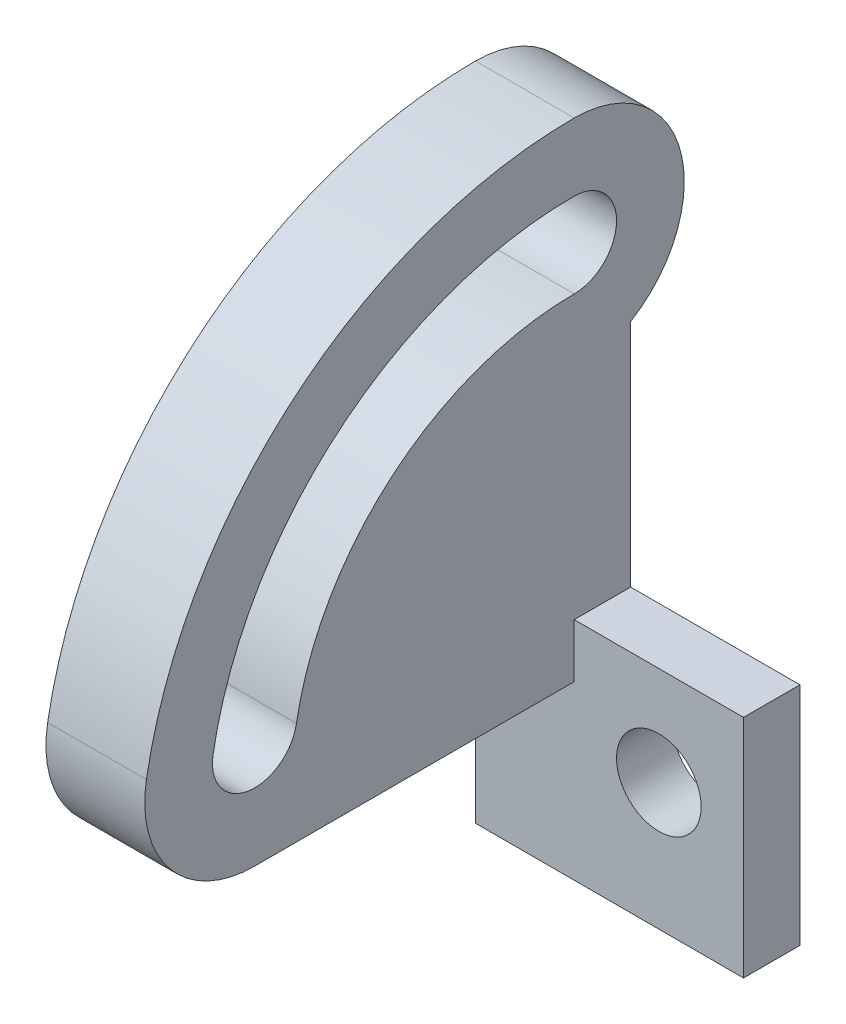
ISO-10303-21;
HEADER;
FILE_DESCRIPTION(('STEP AP214'),'2;1');
FILE_NAME('part.step','',(''),(''),'','','');
FILE_SCHEMA(('AUTOMOTIVE_DESIGN { 1 0 10303 214 1 1 1 1 }'));
ENDSEC;
DATA;
#1=APPLICATION_CONTEXT('core data for automotive mechanical design processes');
#2=APPLICATION_PROTOCOL_DEFINITION('international standard','automotive_design',2000,#1);
#3=PRODUCT_CONTEXT('',#1,'mechanical');
#4=PRODUCT('Part','Part','',(#3));
#5=PRODUCT_RELATED_PRODUCT_CATEGORY('part','',(#4));
#6=PRODUCT_DEFINITION_FORMATION('','',#4);
#7=PRODUCT_DEFINITION_CONTEXT('part definition',#1,'design');
#8=PRODUCT_DEFINITION('design','',#6,#7);
#9=PRODUCT_DEFINITION_SHAPE('','',#8);
#10=(LENGTH_UNIT() NAMED_UNIT(*) SI_UNIT(.MILLI.,.METRE.));
#11=(NAMED_UNIT(*) PLANE_ANGLE_UNIT() SI_UNIT($,.RADIAN.));
#12=(NAMED_UNIT(*) SI_UNIT($,.STERADIAN.) SOLID_ANGLE_UNIT());
#13=UNCERTAINTY_MEASURE_WITH_UNIT(LENGTH_MEASURE(1.E-05),#10,'distance_accuracy_value','');
#14=(GEOMETRIC_REPRESENTATION_CONTEXT(3) GLOBAL_UNCERTAINTY_ASSIGNED_CONTEXT((#13)) GLOBAL_UNIT_ASSIGNED_CONTEXT((#10,
#11,#12)) REPRESENTATION_CONTEXT('',''));
#15=CARTESIAN_POINT('',(0.,0.,0.));
#16=DIRECTION('',(0.,0.,1.));
#17=DIRECTION('',(1.,0.,0.));
#18=AXIS2_PLACEMENT_3D('',#15,#16,#17);
#19=CARTESIAN_POINT('',(-40.8872702973605,15.5365853658537,2.));
#20=DIRECTION('',(0.,-1.,0.));
#21=DIRECTION('',(0.,0.,-1.));
#22=AXIS2_PLACEMENT_3D('',#19,#20,#21);
#23=PLANE('',#22);
#24=DIRECTION('',(-1.,0.,0.));
#25=VECTOR('',#24,1.);
#26=CARTESIAN_POINT('',(-40.8872702973605,15.5365853658537,2.));
#27=LINE('',#26,#25);
#28=CARTESIAN_POINT('',(-34.3872702973605,15.5365853658537,2.));
#29=VERTEX_POINT('',#28);
#30=CARTESIAN_POINT('',(-40.3872702973605,15.5365853658537,2.));
#31=VERTEX_POINT('',#30);
#32=EDGE_CURVE('E11',#29,#31,#27,.T.);
#33=ORIENTED_EDGE('',*,*,#32,.F.);
#34=DIRECTION('',(0.,0.,1.));
#35=VECTOR('',#34,1.);
#36=CARTESIAN_POINT('',(-34.3872702973605,15.5365853658537,0.));
#37=LINE('',#36,#35);
#38=CARTESIAN_POINT('',(-34.3872702973605,15.5365853658537,0.));
#39=VERTEX_POINT('',#38);
#40=EDGE_CURVE('E130',#39,#29,#37,.T.);
#41=ORIENTED_EDGE('',*,*,#40,.F.);
#42=DIRECTION('',(-1.,0.,0.));
#43=VECTOR('',#42,1.);
#44=CARTESIAN_POINT('',(-40.8872702973605,15.5365853658537,0.));
#45=LINE('',#44,#43);
#46=CARTESIAN_POINT('',(-40.3872702973605,15.5365853658537,0.));
#47=VERTEX_POINT('',#46);
#48=EDGE_CURVE('E36',#39,#47,#45,.T.);
#49=ORIENTED_EDGE('',*,*,#48,.T.);
#50=DIRECTION('',(0.,0.,1.));
#51=VECTOR('',#50,1.);
#52=CARTESIAN_POINT('',(-40.3872702973605,15.5365853658537,2.));
#53=LINE('',#52,#51);
#54=EDGE_CURVE('E192',#47,#31,#53,.T.);
#55=ORIENTED_EDGE('',*,*,#54,.T.);
#56=EDGE_LOOP('',(#33,#41,#49,#55));
#57=FACE_BOUND('',#56,.T.);
#58=ADVANCED_FACE('F33',(#57),#23,.F.);
#59=CARTESIAN_POINT('',(0.,0.,2.));
#60=DIRECTION('',(0.,0.,1.));
#61=DIRECTION('',(1.,0.,0.));
#62=AXIS2_PLACEMENT_3D('',#59,#60,#61);
#63=PLANE('',#62);
#64=DIRECTION('',(1.,0.,0.));
#65=VECTOR('',#64,1.);
#66=CARTESIAN_POINT('',(-40.8872702973605,7.53658536585366,2.));
#67=LINE('',#66,#65);
#68=CARTESIAN_POINT('',(-43.8872702973605,7.53658536585366,2.));
#69=VERTEX_POINT('',#68);
#70=CARTESIAN_POINT('',(-34.3872702973605,7.53658536585367,2.));
#71=VERTEX_POINT('',#70);
#72=EDGE_CURVE('E159',#69,#71,#67,.T.);
#73=ORIENTED_EDGE('',*,*,#72,.T.);
#74=DIRECTION('',(0.,-1.,0.));
#75=VECTOR('',#74,1.);
#76=CARTESIAN_POINT('',(-34.3872702973605,15.5365853658537,2.));
#77=LINE('',#76,#75);
#78=EDGE_CURVE('E136',#29,#71,#77,.T.);
#79=ORIENTED_EDGE('',*,*,#78,.F.);
#80=ORIENTED_EDGE('',*,*,#32,.T.);
#81=DIRECTION('',(0.,-1.,0.));
#82=VECTOR('',#81,1.);
#83=CARTESIAN_POINT('',(-40.3872702973605,13.6332115861991,2.));
#84=LINE('',#83,#82);
#85=CARTESIAN_POINT('',(-40.3872702973605,13.6332115861991,2.));
#86=VERTEX_POINT('',#85);
#87=EDGE_CURVE('E46',#31,#86,#84,.T.);
#88=ORIENTED_EDGE('',*,*,#87,.T.);
#89=DIRECTION('',(-1.,0.,0.));
#90=VECTOR('',#89,1.);
#91=CARTESIAN_POINT('',(-40.3872702973605,13.6332115861991,2.));
#92=LINE('',#91,#90);
#93=CARTESIAN_POINT('',(-43.8872702973605,13.6332115861991,2.));
#94=VERTEX_POINT('',#93);
#95=EDGE_CURVE('E168',#86,#94,#92,.T.);
#96=ORIENTED_EDGE('',*,*,#95,.T.);
#97=DIRECTION('',(0.,-1.,0.));
#98=VECTOR('',#97,1.);
#99=CARTESIAN_POINT('',(-43.8872702973605,15.5365853658537,2.));
#100=LINE('',#99,#98);
#101=EDGE_CURVE('E162',#94,#69,#100,.T.);
#102=ORIENTED_EDGE('',*,*,#101,.T.);
#103=EDGE_LOOP('',(#73,#79,#80,#88,#96,#102));
#104=FACE_BOUND('',#103,.T.);
#105=CARTESIAN_POINT('',(-37.3872702973605,12.0365853658537,2.));
#106=DIRECTION('',(0.,0.,1.));
#107=DIRECTION('',(1.,0.,0.));
#108=AXIS2_PLACEMENT_3D('',#105,#106,#107);
#109=CIRCLE('',#108,1.5);
#110=CARTESIAN_POINT('',(-35.8872702973605,12.0365853658537,2.));
#111=VERTEX_POINT('',#110);
#112=EDGE_CURVE('E146',#111,#111,#109,.T.);
#113=ORIENTED_EDGE('',*,*,#112,.F.);
#114=EDGE_LOOP('',(#113));
#115=FACE_BOUND('',#114,.T.);
#116=ADVANCED_FACE('F239',(#104,#115),#63,.T.);
#117=CARTESIAN_POINT('',(0.,0.,0.));
#118=DIRECTION('',(0.,0.,1.));
#119=DIRECTION('',(1.,0.,0.));
#120=AXIS2_PLACEMENT_3D('',#117,#118,#119);
#121=PLANE('',#120);
#122=DIRECTION('',(0.,-1.,0.));
#123=VECTOR('',#122,1.);
#124=CARTESIAN_POINT('',(-34.3872702973605,15.5365853658537,0.));
#125=LINE('',#124,#123);
#126=CARTESIAN_POINT('',(-34.3872702973605,7.53658536585367,0.));
#127=VERTEX_POINT('',#126);
#128=EDGE_CURVE('E126',#39,#127,#125,.T.);
#129=ORIENTED_EDGE('',*,*,#128,.T.);
#130=DIRECTION('',(1.,0.,0.));
#131=VECTOR('',#130,1.);
#132=CARTESIAN_POINT('',(-40.8872702973605,7.53658536585366,0.));
#133=LINE('',#132,#131);
#134=CARTESIAN_POINT('',(-43.8872702973605,7.53658536585366,0.));
#135=VERTEX_POINT('',#134);
#136=EDGE_CURVE('E158',#135,#127,#133,.T.);
#137=ORIENTED_EDGE('',*,*,#136,.F.);
#138=DIRECTION('',(0.,-1.,0.));
#139=VECTOR('',#138,1.);
#140=CARTESIAN_POINT('',(-43.8872702973605,15.5365853658537,0.));
#141=LINE('',#140,#139);
#142=CARTESIAN_POINT('',(-43.8872702973605,23.6865637008933,0.));
#143=VERTEX_POINT('',#142);
#144=EDGE_CURVE('E161',#143,#135,#141,.T.);
#145=ORIENTED_EDGE('',*,*,#144,.F.);
#146=DIRECTION('',(-1.,0.,0.));
#147=VECTOR('',#146,1.);
#148=CARTESIAN_POINT('',(-40.3872702973605,23.6865637008933,0.));
#149=LINE('',#148,#147);
#150=CARTESIAN_POINT('',(-40.3872702973605,23.6865637008933,0.));
#151=VERTEX_POINT('',#150);
#152=EDGE_CURVE('E164',#151,#143,#149,.T.);
#153=ORIENTED_EDGE('',*,*,#152,.F.);
#154=DIRECTION('',(0.,-1.,0.));
#155=VECTOR('',#154,1.);
#156=CARTESIAN_POINT('',(-40.3872702973605,15.5365853658537,0.));
#157=LINE('',#156,#155);
#158=EDGE_CURVE('E145',#151,#47,#157,.T.);
#159=ORIENTED_EDGE('',*,*,#158,.T.);
#160=ORIENTED_EDGE('',*,*,#48,.F.);
#161=EDGE_LOOP('',(#129,#137,#145,#153,#159,#160));
#162=FACE_BOUND('',#161,.T.);
#163=CARTESIAN_POINT('',(-37.3872702973605,12.0365853658537,0.));
#164=DIRECTION('',(0.,0.,1.));
#165=DIRECTION('',(1.,0.,0.));
#166=AXIS2_PLACEMENT_3D('',#163,#164,#165);
#167=CIRCLE('',#166,1.5);
#168=CARTESIAN_POINT('',(-35.8872702973605,12.0365853658537,0.));
#169=VERTEX_POINT('',#168);
#170=EDGE_CURVE('E148',#169,#169,#167,.T.);
#171=ORIENTED_EDGE('',*,*,#170,.T.);
#172=EDGE_LOOP('',(#171));
#173=FACE_BOUND('',#172,.T.);
#174=ADVANCED_FACE('F142',(#162,#173),#121,.F.);
#175=CARTESIAN_POINT('',(-37.3872702973605,12.0365853658537,2.));
#176=DIRECTION('',(0.,0.,-1.));
#177=DIRECTION('',(-1.,0.,0.));
#178=AXIS2_PLACEMENT_3D('',#175,#176,#177);
#179=CYLINDRICAL_SURFACE('',#178,1.5);
#180=ORIENTED_EDGE('',*,*,#112,.T.);
#181=EDGE_LOOP('',(#180));
#182=FACE_BOUND('',#181,.T.);
#183=ORIENTED_EDGE('',*,*,#170,.F.);
#184=EDGE_LOOP('',(#183));
#185=FACE_BOUND('',#184,.T.);
#186=ADVANCED_FACE('F282',(#182,#185),#179,.F.);
#187=CARTESIAN_POINT('',(-40.8872702973605,7.53658536585366,0.));
#188=DIRECTION('',(0.,-1.,0.));
#189=DIRECTION('',(0.,0.,-1.));
#190=AXIS2_PLACEMENT_3D('',#187,#188,#189);
#191=PLANE('',#190);
#192=ORIENTED_EDGE('',*,*,#72,.F.);
#193=DIRECTION('',(0.,0.,1.));
#194=VECTOR('',#193,1.);
#195=CARTESIAN_POINT('',(-43.8872702973605,7.53658536585366,0.));
#196=LINE('',#195,#194);
#197=EDGE_CURVE('E153',#135,#69,#196,.T.);
#198=ORIENTED_EDGE('',*,*,#197,.F.);
#199=ORIENTED_EDGE('',*,*,#136,.T.);
#200=DIRECTION('',(0.,0.,1.));
#201=VECTOR('',#200,1.);
#202=CARTESIAN_POINT('',(-34.3872702973605,7.53658536585367,0.));
#203=LINE('',#202,#201);
#204=EDGE_CURVE('E132',#127,#71,#203,.T.);
#205=ORIENTED_EDGE('',*,*,#204,.T.);
#206=EDGE_LOOP('',(#192,#198,#199,#205));
#207=FACE_BOUND('',#206,.T.);
#208=ADVANCED_FACE('F243',(#207),#191,.T.);
#209=CARTESIAN_POINT('',(-43.8872702973605,15.5365853658537,0.));
#210=DIRECTION('',(-1.,0.,0.));
#211=DIRECTION('',(0.,0.,1.));
#212=AXIS2_PLACEMENT_3D('',#209,#210,#211);
#213=PLANE('',#212);
#214=ORIENTED_EDGE('',*,*,#101,.F.);
#215=DIRECTION('',(0.,0.,1.));
#216=VECTOR('',#215,1.);
#217=CARTESIAN_POINT('',(-43.8872702973605,13.6332115861991,13.3234299840174));
#218=LINE('',#217,#216);
#219=CARTESIAN_POINT('',(-43.8872702973605,13.6332115861991,13.3234299840174));
#220=VERTEX_POINT('',#219);
#221=EDGE_CURVE('E223',#94,#220,#218,.T.);
#222=ORIENTED_EDGE('',*,*,#221,.T.);
#223=CARTESIAN_POINT('',(-43.8872702973605,17.5332115861991,13.3234299840174));
#224=DIRECTION('',(-1.,0.,0.));
#225=DIRECTION('',(0.,-1.,0.));
#226=AXIS2_PLACEMENT_3D('',#223,#224,#225);
#227=CIRCLE('',#226,3.89999999999999);
#228=CARTESIAN_POINT('',(-43.8872702973605,18.2104394791001,17.164180220765));
#229=VERTEX_POINT('',#228);
#230=EDGE_CURVE('E220',#220,#229,#227,.T.);
#231=ORIENTED_EDGE('',*,*,#230,.T.);
#232=CARTESIAN_POINT('',(-43.8872702973605,15.5365853658537,2.));
#233=DIRECTION('',(-1.,0.,0.));
#234=DIRECTION('',(0.,-1.,0.));
#235=AXIS2_PLACEMENT_3D('',#232,#233,#234);
#236=CIRCLE('',#235,15.3981121435962);
#237=CARTESIAN_POINT('',(-43.8872702973605,30.9346975094499,2.));
#238=VERTEX_POINT('',#237);
#239=EDGE_CURVE('E217',#229,#238,#236,.T.);
#240=ORIENTED_EDGE('',*,*,#239,.T.);
#241=CARTESIAN_POINT('',(-43.8872702973605,27.0346975094499,2.));
#242=DIRECTION('',(-1.,0.,0.));
#243=DIRECTION('',(0.,-1.,0.));
#244=AXIS2_PLACEMENT_3D('',#241,#242,#243);
#245=CIRCLE('',#244,3.9);
#246=EDGE_CURVE('E214',#238,#143,#245,.T.);
#247=ORIENTED_EDGE('',*,*,#246,.T.);
#248=ORIENTED_EDGE('',*,*,#144,.T.);
#249=ORIENTED_EDGE('',*,*,#197,.T.);
#250=EDGE_LOOP('',(#214,#222,#231,#240,#247,#248,#249));
#251=FACE_BOUND('',#250,.T.);
#252=CARTESIAN_POINT('',(-43.8872702973605,15.5365853658537,2.));
#253=DIRECTION('',(1.,0.,0.));
#254=DIRECTION('',(0.,-1.,0.));
#255=AXIS2_PLACEMENT_3D('',#252,#253,#254);
#256=CIRCLE('',#255,9.99811214359624);
#257=CARTESIAN_POINT('',(-43.8872702973605,25.5346975094499,2.));
#258=VERTEX_POINT('',#257);
#259=CARTESIAN_POINT('',(-43.8872702973605,17.2727393196987,11.8462183544991));
#260=VERTEX_POINT('',#259);
#261=EDGE_CURVE('E232',#258,#260,#256,.T.);
#262=ORIENTED_EDGE('',*,*,#261,.F.);
#263=CARTESIAN_POINT('',(-43.8872702973605,27.0346975094499,2.));
#264=DIRECTION('',(-1.,0.,0.));
#265=DIRECTION('',(0.,-1.,0.));
#266=AXIS2_PLACEMENT_3D('',#263,#264,#265);
#267=CIRCLE('',#266,1.5);
#268=CARTESIAN_POINT('',(-43.8872702973605,28.5346975094499,2.));
#269=VERTEX_POINT('',#268);
#270=EDGE_CURVE('E235',#269,#258,#267,.T.);
#271=ORIENTED_EDGE('',*,*,#270,.F.);
#272=CARTESIAN_POINT('',(-43.8872702973605,15.5365853658537,2.));
#273=DIRECTION('',(-1.,0.,0.));
#274=DIRECTION('',(0.,-1.,0.));
#275=AXIS2_PLACEMENT_3D('',#272,#273,#274);
#276=CIRCLE('',#275,12.9981121435962);
#277=CARTESIAN_POINT('',(-43.8872702973605,17.7936838526995,14.8006416135357));
#278=VERTEX_POINT('',#277);
#279=EDGE_CURVE('E226',#278,#269,#276,.T.);
#280=ORIENTED_EDGE('',*,*,#279,.F.);
#281=CARTESIAN_POINT('',(-43.8872702973605,17.5332115861991,13.3234299840174));
#282=DIRECTION('',(-1.,0.,0.));
#283=DIRECTION('',(0.,-1.,0.));
#284=AXIS2_PLACEMENT_3D('',#281,#282,#283);
#285=CIRCLE('',#284,1.5);
#286=EDGE_CURVE('E229',#260,#278,#285,.T.);
#287=ORIENTED_EDGE('',*,*,#286,.F.);
#288=EDGE_LOOP('',(#262,#271,#280,#287));
#289=FACE_BOUND('',#288,.T.);
#290=ADVANCED_FACE('F249',(#251,#289),#213,.T.);
#291=CARTESIAN_POINT('',(-40.3872702973605,27.0346975094499,2.));
#292=DIRECTION('',(-1.,0.,0.));
#293=DIRECTION('',(0.,-1.,0.));
#294=AXIS2_PLACEMENT_3D('',#291,#292,#293);
#295=CYLINDRICAL_SURFACE('',#294,3.9);
#296=ORIENTED_EDGE('',*,*,#152,.T.);
#297=ORIENTED_EDGE('',*,*,#246,.F.);
#298=DIRECTION('',(-1.,0.,0.));
#299=VECTOR('',#298,1.);
#300=CARTESIAN_POINT('',(-40.3872702973605,30.9346975094499,2.));
#301=LINE('',#300,#299);
#302=CARTESIAN_POINT('',(-40.3872702973605,30.9346975094499,2.));
#303=VERTEX_POINT('',#302);
#304=EDGE_CURVE('E174',#303,#238,#301,.T.);
#305=ORIENTED_EDGE('',*,*,#304,.F.);
#306=CARTESIAN_POINT('',(-40.3872702973605,27.0346975094499,2.));
#307=DIRECTION('',(-1.,0.,0.));
#308=DIRECTION('',(0.,-1.,0.));
#309=AXIS2_PLACEMENT_3D('',#306,#307,#308);
#310=CIRCLE('',#309,3.9);
#311=EDGE_CURVE('E179',#303,#151,#310,.T.);
#312=ORIENTED_EDGE('',*,*,#311,.T.);
#313=EDGE_LOOP('',(#296,#297,#305,#312));
#314=FACE_BOUND('',#313,.T.);
#315=ADVANCED_FACE('F247',(#314),#295,.T.);
#316=CARTESIAN_POINT('',(-40.3872702973605,15.5365853658537,2.));
#317=DIRECTION('',(-1.,0.,0.));
#318=DIRECTION('',(0.,-1.,0.));
#319=AXIS2_PLACEMENT_3D('',#316,#317,#318);
#320=CYLINDRICAL_SURFACE('',#319,15.3981121435962);
#321=ORIENTED_EDGE('',*,*,#304,.T.);
#322=ORIENTED_EDGE('',*,*,#239,.F.);
#323=DIRECTION('',(-1.,0.,0.));
#324=VECTOR('',#323,1.);
#325=CARTESIAN_POINT('',(-40.3872702973605,18.2104394791001,17.164180220765));
#326=LINE('',#325,#324);
#327=CARTESIAN_POINT('',(-40.3872702973605,18.2104394791001,17.164180220765));
#328=VERTEX_POINT('',#327);
#329=EDGE_CURVE('E172',#328,#229,#326,.T.);
#330=ORIENTED_EDGE('',*,*,#329,.F.);
#331=CARTESIAN_POINT('',(-40.3872702973605,15.5365853658537,2.));
#332=DIRECTION('',(-1.,0.,0.));
#333=DIRECTION('',(0.,-1.,0.));
#334=AXIS2_PLACEMENT_3D('',#331,#332,#333);
#335=CIRCLE('',#334,15.3981121435962);
#336=EDGE_CURVE('E182',#328,#303,#335,.T.);
#337=ORIENTED_EDGE('',*,*,#336,.T.);
#338=EDGE_LOOP('',(#321,#322,#330,#337));
#339=FACE_BOUND('',#338,.T.);
#340=ADVANCED_FACE('F254',(#339),#320,.T.);
#341=CARTESIAN_POINT('',(-40.3872702973605,17.5332115861991,13.3234299840174));
#342=DIRECTION('',(-1.,0.,0.));
#343=DIRECTION('',(0.,-1.,0.));
#344=AXIS2_PLACEMENT_3D('',#341,#342,#343);
#345=CYLINDRICAL_SURFACE('',#344,3.89999999999999);
#346=ORIENTED_EDGE('',*,*,#329,.T.);
#347=ORIENTED_EDGE('',*,*,#230,.F.);
#348=DIRECTION('',(-1.,0.,0.));
#349=VECTOR('',#348,1.);
#350=CARTESIAN_POINT('',(-40.3872702973605,13.6332115861991,13.3234299840174));
#351=LINE('',#350,#349);
#352=CARTESIAN_POINT('',(-40.3872702973605,13.6332115861991,13.3234299840174));
#353=VERTEX_POINT('',#352);
#354=EDGE_CURVE('E170',#353,#220,#351,.T.);
#355=ORIENTED_EDGE('',*,*,#354,.F.);
#356=CARTESIAN_POINT('',(-40.3872702973605,17.5332115861991,13.3234299840174));
#357=DIRECTION('',(-1.,0.,0.));
#358=DIRECTION('',(0.,-1.,0.));
#359=AXIS2_PLACEMENT_3D('',#356,#357,#358);
#360=CIRCLE('',#359,3.89999999999999);
#361=EDGE_CURVE('E185',#353,#328,#360,.T.);
#362=ORIENTED_EDGE('',*,*,#361,.T.);
#363=EDGE_LOOP('',(#346,#347,#355,#362));
#364=FACE_BOUND('',#363,.T.);
#365=ADVANCED_FACE('F264',(#364),#345,.T.);
#366=CARTESIAN_POINT('',(-40.3872702973605,13.6332115861991,13.3234299840174));
#367=DIRECTION('',(0.,-1.,0.));
#368=DIRECTION('',(1.,0.,0.));
#369=AXIS2_PLACEMENT_3D('',#366,#367,#368);
#370=PLANE('',#369);
#371=ORIENTED_EDGE('',*,*,#354,.T.);
#372=ORIENTED_EDGE('',*,*,#221,.F.);
#373=ORIENTED_EDGE('',*,*,#95,.F.);
#374=DIRECTION('',(0.,0.,1.));
#375=VECTOR('',#374,1.);
#376=CARTESIAN_POINT('',(-40.3872702973605,13.6332115861991,13.3234299840174));
#377=LINE('',#376,#375);
#378=EDGE_CURVE('E188',#86,#353,#377,.T.);
#379=ORIENTED_EDGE('',*,*,#378,.T.);
#380=EDGE_LOOP('',(#371,#372,#373,#379));
#381=FACE_BOUND('',#380,.T.);
#382=ADVANCED_FACE('F261',(#381),#370,.T.);
#383=CARTESIAN_POINT('',(-40.3872702973605,27.0346975094499,2.));
#384=DIRECTION('',(-1.,0.,0.));
#385=DIRECTION('',(0.,-1.,0.));
#386=AXIS2_PLACEMENT_3D('',#383,#384,#385);
#387=PLANE('',#386);
#388=CARTESIAN_POINT('',(-40.3872702973605,15.5365853658537,2.));
#389=DIRECTION('',(-1.,0.,0.));
#390=DIRECTION('',(0.,-1.,0.));
#391=AXIS2_PLACEMENT_3D('',#388,#389,#390);
#392=CIRCLE('',#391,12.9981121435962);
#393=CARTESIAN_POINT('',(-40.3872702973605,17.7936838526995,14.8006416135357));
#394=VERTEX_POINT('',#393);
#395=CARTESIAN_POINT('',(-40.3872702973605,28.5346975094499,2.));
#396=VERTEX_POINT('',#395);
#397=EDGE_CURVE('E198',#394,#396,#392,.T.);
#398=ORIENTED_EDGE('',*,*,#397,.T.);
#399=CARTESIAN_POINT('',(-40.3872702973605,27.0346975094499,2.));
#400=DIRECTION('',(-1.,0.,0.));
#401=DIRECTION('',(0.,-1.,0.));
#402=AXIS2_PLACEMENT_3D('',#399,#400,#401);
#403=CIRCLE('',#402,1.5);
#404=CARTESIAN_POINT('',(-40.3872702973605,25.5346975094499,2.));
#405=VERTEX_POINT('',#404);
#406=EDGE_CURVE('E211',#396,#405,#403,.T.);
#407=ORIENTED_EDGE('',*,*,#406,.T.);
#408=CARTESIAN_POINT('',(-40.3872702973605,15.5365853658537,2.));
#409=DIRECTION('',(1.,0.,0.));
#410=DIRECTION('',(0.,-1.,0.));
#411=AXIS2_PLACEMENT_3D('',#408,#409,#410);
#412=CIRCLE('',#411,9.99811214359624);
#413=CARTESIAN_POINT('',(-40.3872702973605,17.2727393196987,11.8462183544991));
#414=VERTEX_POINT('',#413);
#415=EDGE_CURVE('E208',#405,#414,#412,.T.);
#416=ORIENTED_EDGE('',*,*,#415,.T.);
#417=CARTESIAN_POINT('',(-40.3872702973605,17.5332115861991,13.3234299840174));
#418=DIRECTION('',(-1.,0.,0.));
#419=DIRECTION('',(0.,-1.,0.));
#420=AXIS2_PLACEMENT_3D('',#417,#418,#419);
#421=CIRCLE('',#420,1.5);
#422=EDGE_CURVE('E205',#414,#394,#421,.T.);
#423=ORIENTED_EDGE('',*,*,#422,.T.);
#424=EDGE_LOOP('',(#398,#407,#416,#423));
#425=FACE_BOUND('',#424,.T.);
#426=ORIENTED_EDGE('',*,*,#54,.F.);
#427=ORIENTED_EDGE('',*,*,#158,.F.);
#428=ORIENTED_EDGE('',*,*,#311,.F.);
#429=ORIENTED_EDGE('',*,*,#336,.F.);
#430=ORIENTED_EDGE('',*,*,#361,.F.);
#431=ORIENTED_EDGE('',*,*,#378,.F.);
#432=ORIENTED_EDGE('',*,*,#87,.F.);
#433=EDGE_LOOP('',(#426,#427,#428,#429,#430,#431,#432));
#434=FACE_BOUND('',#433,.T.);
#435=ADVANCED_FACE('F257',(#425,#434),#387,.F.);
#436=CARTESIAN_POINT('',(-40.3872702973605,27.0346975094499,2.));
#437=DIRECTION('',(-1.,0.,0.));
#438=DIRECTION('',(0.,-1.,0.));
#439=AXIS2_PLACEMENT_3D('',#436,#437,#438);
#440=CYLINDRICAL_SURFACE('',#439,1.5);
#441=DIRECTION('',(-1.,0.,0.));
#442=VECTOR('',#441,1.);
#443=CARTESIAN_POINT('',(-40.3872702973605,28.5346975094499,2.));
#444=LINE('',#443,#442);
#445=EDGE_CURVE('E194',#396,#269,#444,.T.);
#446=ORIENTED_EDGE('',*,*,#445,.T.);
#447=ORIENTED_EDGE('',*,*,#270,.T.);
#448=DIRECTION('',(-1.,0.,0.));
#449=VECTOR('',#448,1.);
#450=CARTESIAN_POINT('',(-40.3872702973605,25.5346975094499,2.));
#451=LINE('',#450,#449);
#452=EDGE_CURVE('E195',#405,#258,#451,.T.);
#453=ORIENTED_EDGE('',*,*,#452,.F.);
#454=ORIENTED_EDGE('',*,*,#406,.F.);
#455=EDGE_LOOP('',(#446,#447,#453,#454));
#456=FACE_BOUND('',#455,.T.);
#457=ADVANCED_FACE('F327',(#456),#440,.F.);
#458=CARTESIAN_POINT('',(-40.3872702973605,15.5365853658537,2.));
#459=DIRECTION('',(-1.,0.,0.));
#460=DIRECTION('',(0.,-1.,0.));
#461=AXIS2_PLACEMENT_3D('',#458,#459,#460);
#462=CYLINDRICAL_SURFACE('',#461,12.9981121435962);
#463=DIRECTION('',(-1.,0.,0.));
#464=VECTOR('',#463,1.);
#465=CARTESIAN_POINT('',(-40.3872702973605,17.7936838526995,14.8006416135357));
#466=LINE('',#465,#464);
#467=EDGE_CURVE('E200',#394,#278,#466,.T.);
#468=ORIENTED_EDGE('',*,*,#467,.T.);
#469=ORIENTED_EDGE('',*,*,#279,.T.);
#470=ORIENTED_EDGE('',*,*,#445,.F.);
#471=ORIENTED_EDGE('',*,*,#397,.F.);
#472=EDGE_LOOP('',(#468,#469,#470,#471));
#473=FACE_BOUND('',#472,.T.);
#474=ADVANCED_FACE('F337',(#473),#462,.F.);
#475=CARTESIAN_POINT('',(-40.3872702973605,17.5332115861991,13.3234299840174));
#476=DIRECTION('',(-1.,0.,0.));
#477=DIRECTION('',(0.,-1.,0.));
#478=AXIS2_PLACEMENT_3D('',#475,#476,#477);
#479=CYLINDRICAL_SURFACE('',#478,1.5);
#480=DIRECTION('',(-1.,0.,0.));
#481=VECTOR('',#480,1.);
#482=CARTESIAN_POINT('',(-40.3872702973605,17.2727393196987,11.8462183544991));
#483=LINE('',#482,#481);
#484=EDGE_CURVE('E197',#414,#260,#483,.T.);
#485=ORIENTED_EDGE('',*,*,#484,.T.);
#486=ORIENTED_EDGE('',*,*,#286,.T.);
#487=ORIENTED_EDGE('',*,*,#467,.F.);
#488=ORIENTED_EDGE('',*,*,#422,.F.);
#489=EDGE_LOOP('',(#485,#486,#487,#488));
#490=FACE_BOUND('',#489,.T.);
#491=ADVANCED_FACE('F347',(#490),#479,.F.);
#492=CARTESIAN_POINT('',(-40.3872702973605,15.5365853658537,2.));
#493=DIRECTION('',(-1.,0.,0.));
#494=DIRECTION('',(0.,-1.,0.));
#495=AXIS2_PLACEMENT_3D('',#492,#493,#494);
#496=CYLINDRICAL_SURFACE('',#495,9.99811214359624);
#497=ORIENTED_EDGE('',*,*,#452,.T.);
#498=ORIENTED_EDGE('',*,*,#261,.T.);
#499=ORIENTED_EDGE('',*,*,#484,.F.);
#500=ORIENTED_EDGE('',*,*,#415,.F.);
#501=EDGE_LOOP('',(#497,#498,#499,#500));
#502=FACE_BOUND('',#501,.T.);
#503=ADVANCED_FACE('F357',(#502),#496,.T.);
#504=CARTESIAN_POINT('',(-34.3872702973605,15.5365853658537,0.));
#505=DIRECTION('',(-1.,0.,0.));
#506=DIRECTION('',(0.,-1.,0.));
#507=AXIS2_PLACEMENT_3D('',#504,#505,#506);
#508=PLANE('',#507);
#509=ORIENTED_EDGE('',*,*,#78,.T.);
#510=ORIENTED_EDGE('',*,*,#204,.F.);
#511=ORIENTED_EDGE('',*,*,#128,.F.);
#512=ORIENTED_EDGE('',*,*,#40,.T.);
#513=EDGE_LOOP('',(#509,#510,#511,#512));
#514=FACE_BOUND('',#513,.T.);
#515=ADVANCED_FACE('F129',(#514),#508,.F.);
#516=CLOSED_SHELL('',(#58,#116,#174,#186,#208,#290,#315,#340,#365,#382,#435,#457,#474,#491,#503,#515));
#517=MANIFOLD_SOLID_BREP('B2',#516);
#518=ADVANCED_BREP_SHAPE_REPRESENTATION('',(#18,#517),#14);
#519=SHAPE_DEFINITION_REPRESENTATION(#9,#518);
ENDSEC;
END-ISO-10303-21;
